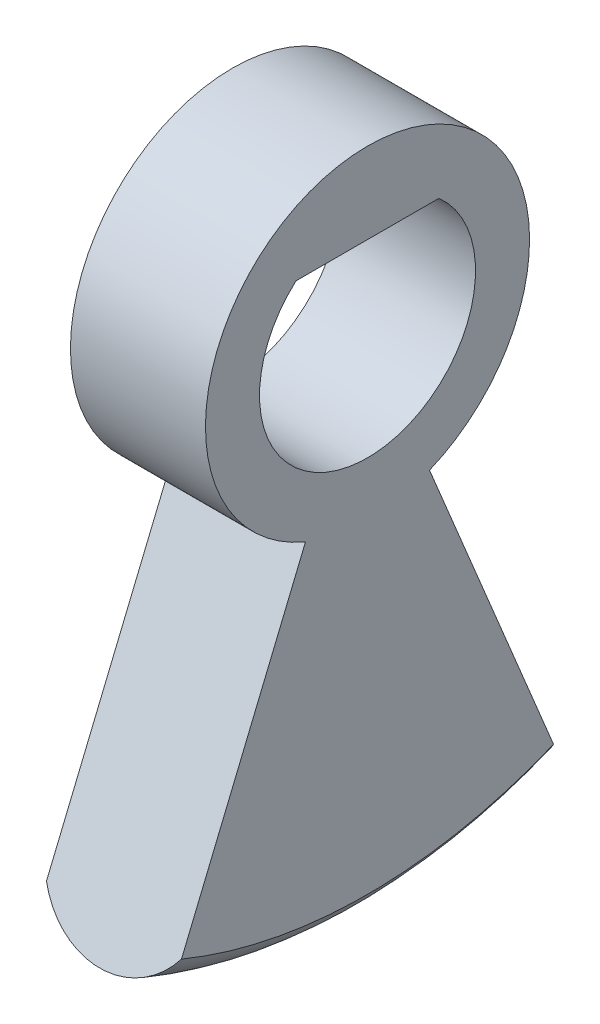
ISO-10303-21;
HEADER;
FILE_DESCRIPTION(('STEP AP214'),'2;1');
FILE_NAME('part.step','',(''),(''),'','','');
FILE_SCHEMA(('AUTOMOTIVE_DESIGN { 1 0 10303 214 1 1 1 1 }'));
ENDSEC;
DATA;
#1=APPLICATION_CONTEXT('core data for automotive mechanical design processes');
#2=APPLICATION_PROTOCOL_DEFINITION('international standard','automotive_design',2000,#1);
#3=PRODUCT_CONTEXT('',#1,'mechanical');
#4=PRODUCT('Part','Part','',(#3));
#5=PRODUCT_RELATED_PRODUCT_CATEGORY('part','',(#4));
#6=PRODUCT_DEFINITION_FORMATION('','',#4);
#7=PRODUCT_DEFINITION_CONTEXT('part definition',#1,'design');
#8=PRODUCT_DEFINITION('design','',#6,#7);
#9=PRODUCT_DEFINITION_SHAPE('','',#8);
#10=(LENGTH_UNIT() NAMED_UNIT(*) SI_UNIT(.MILLI.,.METRE.));
#11=(NAMED_UNIT(*) PLANE_ANGLE_UNIT() SI_UNIT($,.RADIAN.));
#12=(NAMED_UNIT(*) SI_UNIT($,.STERADIAN.) SOLID_ANGLE_UNIT());
#13=UNCERTAINTY_MEASURE_WITH_UNIT(LENGTH_MEASURE(1.E-05),#10,'distance_accuracy_value','');
#14=(GEOMETRIC_REPRESENTATION_CONTEXT(3) GLOBAL_UNCERTAINTY_ASSIGNED_CONTEXT((#13)) GLOBAL_UNIT_ASSIGNED_CONTEXT((#10,
#11,#12)) REPRESENTATION_CONTEXT('',''));
#15=CARTESIAN_POINT('',(0.,0.,0.));
#16=DIRECTION('',(0.,0.,1.));
#17=DIRECTION('',(1.,0.,0.));
#18=AXIS2_PLACEMENT_3D('',#15,#16,#17);
#19=CARTESIAN_POINT('',(1.25,0.,0.));
#20=DIRECTION('',(-1.,0.,0.));
#21=DIRECTION('',(0.,-1.,0.));
#22=AXIS2_PLACEMENT_3D('',#19,#20,#21);
#23=PLANE('',#22);
#24=DIRECTION('',(0.,0.,1.));
#25=VECTOR('',#24,1.);
#26=CARTESIAN_POINT('',(1.25,1.5,0.));
#27=LINE('',#26,#25);
#28=CARTESIAN_POINT('',(1.25,1.5,-1.3228756555323));
#29=VERTEX_POINT('',#28);
#30=CARTESIAN_POINT('',(1.25,1.5,1.3228756555323));
#31=VERTEX_POINT('',#30);
#32=EDGE_CURVE('E141',#29,#31,#27,.T.);
#33=ORIENTED_EDGE('',*,*,#32,.F.);
#34=CARTESIAN_POINT('',(1.25,0.,0.));
#35=DIRECTION('',(1.,0.,0.));
#36=DIRECTION('',(0.,1.,0.));
#37=AXIS2_PLACEMENT_3D('',#34,#35,#36);
#38=CIRCLE('',#37,2.);
#39=EDGE_CURVE('E91',#31,#29,#38,.T.);
#40=ORIENTED_EDGE('',*,*,#39,.F.);
#41=EDGE_LOOP('',(#33,#40));
#42=FACE_BOUND('',#41,.T.);
#43=CARTESIAN_POINT('',(1.25,0.,0.));
#44=DIRECTION('',(-1.,0.,0.));
#45=DIRECTION('',(0.,0.,1.));
#46=AXIS2_PLACEMENT_3D('',#43,#44,#45);
#47=CIRCLE('',#46,3.);
#48=CARTESIAN_POINT('',(1.25,-2.77163859753387,1.14805029709525));
#49=VERTEX_POINT('',#48);
#50=CARTESIAN_POINT('',(1.25,-2.77163859753387,-1.14805029709525));
#51=VERTEX_POINT('',#50);
#52=EDGE_CURVE('E135',#49,#51,#47,.T.);
#53=ORIENTED_EDGE('',*,*,#52,.F.);
#54=DIRECTION('',(0.,-0.923879532511289,0.382683432365084));
#55=VECTOR('',#54,1.);
#56=CARTESIAN_POINT('',(1.25000000000001,0.,0.));
#57=LINE('',#56,#55);
#58=CARTESIAN_POINT('',(1.25,-8.3149157926016,3.44415089128576));
#59=VERTEX_POINT('',#58);
#60=EDGE_CURVE('E145',#49,#59,#57,.T.);
#61=ORIENTED_EDGE('',*,*,#60,.T.);
#62=CARTESIAN_POINT('',(1.25,0.,0.));
#63=DIRECTION('',(-1.,0.,0.));
#64=DIRECTION('',(0.,-1.,0.));
#65=AXIS2_PLACEMENT_3D('',#62,#63,#64);
#66=CIRCLE('',#65,9.);
#67=CARTESIAN_POINT('',(1.25,-8.3149157926016,-3.44415089128576));
#68=VERTEX_POINT('',#67);
#69=EDGE_CURVE('E156',#68,#59,#66,.T.);
#70=ORIENTED_EDGE('',*,*,#69,.F.);
#71=DIRECTION('',(0.,-0.923879532511289,-0.382683432365084));
#72=VECTOR('',#71,1.);
#73=CARTESIAN_POINT('',(1.25000000000001,0.,0.));
#74=LINE('',#73,#72);
#75=EDGE_CURVE('E136',#51,#68,#74,.T.);
#76=ORIENTED_EDGE('',*,*,#75,.F.);
#77=EDGE_LOOP('',(#53,#61,#70,#76));
#78=FACE_BOUND('',#77,.T.);
#79=ADVANCED_FACE('F69',(#42,#78),#23,.F.);
#80=CARTESIAN_POINT('',(0.,0.,0.));
#81=DIRECTION('',(-1.,0.,0.));
#82=DIRECTION('',(0.,-1.,0.));
#83=AXIS2_PLACEMENT_3D('',#80,#81,#82);
#84=TOROIDAL_SURFACE('',#83,8.21317661740414,1.4770210003245);
#85=ORIENTED_EDGE('',*,*,#69,.T.);
#86=CARTESIAN_POINT('',(0.,-7.58798577371999,3.14304661856887));
#87=DIRECTION('',(0.,-0.382683432365084,-0.923879532511289));
#88=DIRECTION('',(1.,0.,0.));
#89=AXIS2_PLACEMENT_3D('',#86,#87,#88);
#90=CIRCLE('',#89,1.4770210003245);
#91=CARTESIAN_POINT('',(-1.25,-8.3149157926016,3.44415089128576));
#92=VERTEX_POINT('',#91);
#93=EDGE_CURVE('E172',#92,#59,#90,.F.);
#94=ORIENTED_EDGE('',*,*,#93,.F.);
#95=CARTESIAN_POINT('',(-1.25,0.,0.));
#96=DIRECTION('',(-1.,0.,0.));
#97=DIRECTION('',(0.,-1.,0.));
#98=AXIS2_PLACEMENT_3D('',#95,#96,#97);
#99=CIRCLE('',#98,9.);
#100=CARTESIAN_POINT('',(-1.25,-8.3149157926016,-3.44415089128576));
#101=VERTEX_POINT('',#100);
#102=EDGE_CURVE('E153',#101,#92,#99,.T.);
#103=ORIENTED_EDGE('',*,*,#102,.F.);
#104=CARTESIAN_POINT('',(0.,-7.58798577371999,-3.14304661856887));
#105=DIRECTION('',(0.,0.382683432365084,-0.923879532511289));
#106=DIRECTION('',(1.,0.,0.));
#107=AXIS2_PLACEMENT_3D('',#104,#105,#106);
#108=CIRCLE('',#107,1.4770210003245);
#109=EDGE_CURVE('E83',#101,#68,#108,.F.);
#110=ORIENTED_EDGE('',*,*,#109,.T.);
#111=EDGE_LOOP('',(#85,#94,#103,#110));
#112=FACE_BOUND('',#111,.T.);
#113=ADVANCED_FACE('F168',(#112),#84,.T.);
#114=CARTESIAN_POINT('',(-1.25,9.,0.));
#115=DIRECTION('',(1.,0.,0.));
#116=DIRECTION('',(0.,1.,0.));
#117=AXIS2_PLACEMENT_3D('',#114,#115,#116);
#118=PLANE('',#117);
#119=DIRECTION('',(0.,0.,1.));
#120=VECTOR('',#119,1.);
#121=CARTESIAN_POINT('',(-1.25,1.5,0.));
#122=LINE('',#121,#120);
#123=CARTESIAN_POINT('',(-1.25,1.5,-1.3228756555323));
#124=VERTEX_POINT('',#123);
#125=CARTESIAN_POINT('',(-1.25,1.5,1.3228756555323));
#126=VERTEX_POINT('',#125);
#127=EDGE_CURVE('E76',#124,#126,#122,.T.);
#128=ORIENTED_EDGE('',*,*,#127,.T.);
#129=CARTESIAN_POINT('',(-1.25,0.,0.));
#130=DIRECTION('',(1.,0.,0.));
#131=DIRECTION('',(0.,1.,0.));
#132=AXIS2_PLACEMENT_3D('',#129,#130,#131);
#133=CIRCLE('',#132,2.);
#134=EDGE_CURVE('E12',#126,#124,#133,.T.);
#135=ORIENTED_EDGE('',*,*,#134,.T.);
#136=EDGE_LOOP('',(#128,#135));
#137=FACE_BOUND('',#136,.T.);
#138=ORIENTED_EDGE('',*,*,#102,.T.);
#139=DIRECTION('',(0.,0.923879532511289,-0.382683432365084));
#140=VECTOR('',#139,1.);
#141=CARTESIAN_POINT('',(-1.25,0.,0.));
#142=LINE('',#141,#140);
#143=CARTESIAN_POINT('',(-1.25,-2.77163859753387,1.14805029709525));
#144=VERTEX_POINT('',#143);
#145=EDGE_CURVE('E140',#92,#144,#142,.T.);
#146=ORIENTED_EDGE('',*,*,#145,.T.);
#147=CARTESIAN_POINT('',(-1.25,0.,0.));
#148=DIRECTION('',(-1.,0.,0.));
#149=DIRECTION('',(0.,0.,1.));
#150=AXIS2_PLACEMENT_3D('',#147,#148,#149);
#151=CIRCLE('',#150,3.);
#152=CARTESIAN_POINT('',(-1.25,-2.77163859753387,-1.14805029709525));
#153=VERTEX_POINT('',#152);
#154=EDGE_CURVE('E132',#144,#153,#151,.T.);
#155=ORIENTED_EDGE('',*,*,#154,.T.);
#156=DIRECTION('',(0.,0.923879532511289,0.382683432365084));
#157=VECTOR('',#156,1.);
#158=CARTESIAN_POINT('',(-1.25,0.,0.));
#159=LINE('',#158,#157);
#160=EDGE_CURVE('E120',#101,#153,#159,.T.);
#161=ORIENTED_EDGE('',*,*,#160,.F.);
#162=EDGE_LOOP('',(#138,#146,#155,#161));
#163=FACE_BOUND('',#162,.T.);
#164=ADVANCED_FACE('F139',(#137,#163),#118,.F.);
#165=CARTESIAN_POINT('',(-8.75,0.,0.));
#166=DIRECTION('',(1.,0.,0.));
#167=DIRECTION('',(0.,1.,0.));
#168=AXIS2_PLACEMENT_3D('',#165,#166,#167);
#169=CYLINDRICAL_SURFACE('',#168,2.);
#170=DIRECTION('',(1.,0.,0.));
#171=VECTOR('',#170,1.);
#172=CARTESIAN_POINT('',(-8.75,1.5,1.3228756555323));
#173=LINE('',#172,#171);
#174=EDGE_CURVE('E150',#126,#31,#173,.T.);
#175=ORIENTED_EDGE('',*,*,#174,.T.);
#176=ORIENTED_EDGE('',*,*,#39,.T.);
#177=DIRECTION('',(1.,0.,0.));
#178=VECTOR('',#177,1.);
#179=CARTESIAN_POINT('',(-8.75,1.5,-1.3228756555323));
#180=LINE('',#179,#178);
#181=EDGE_CURVE('E151',#124,#29,#180,.T.);
#182=ORIENTED_EDGE('',*,*,#181,.F.);
#183=ORIENTED_EDGE('',*,*,#134,.F.);
#184=EDGE_LOOP('',(#175,#176,#182,#183));
#185=FACE_BOUND('',#184,.T.);
#186=ADVANCED_FACE('F164',(#185),#169,.F.);
#187=CARTESIAN_POINT('',(-8.75,1.5,0.));
#188=DIRECTION('',(0.,1.,0.));
#189=DIRECTION('',(-1.,0.,0.));
#190=AXIS2_PLACEMENT_3D('',#187,#188,#189);
#191=PLANE('',#190);
#192=ORIENTED_EDGE('',*,*,#181,.T.);
#193=ORIENTED_EDGE('',*,*,#32,.T.);
#194=ORIENTED_EDGE('',*,*,#174,.F.);
#195=ORIENTED_EDGE('',*,*,#127,.F.);
#196=EDGE_LOOP('',(#192,#193,#194,#195));
#197=FACE_BOUND('',#196,.T.);
#198=ADVANCED_FACE('F162',(#197),#191,.F.);
#199=CARTESIAN_POINT('',(-1.25,0.,0.));
#200=DIRECTION('',(-1.,0.,0.));
#201=DIRECTION('',(0.,0.,1.));
#202=AXIS2_PLACEMENT_3D('',#199,#200,#201);
#203=CYLINDRICAL_SURFACE('',#202,3.);
#204=ORIENTED_EDGE('',*,*,#52,.T.);
#205=DIRECTION('',(1.,0.,0.));
#206=VECTOR('',#205,1.);
#207=CARTESIAN_POINT('',(0.,-2.77163859753387,-1.14805029709525));
#208=LINE('',#207,#206);
#209=EDGE_CURVE('E123',#153,#51,#208,.T.);
#210=ORIENTED_EDGE('',*,*,#209,.F.);
#211=ORIENTED_EDGE('',*,*,#154,.F.);
#212=DIRECTION('',(1.,0.,0.));
#213=VECTOR('',#212,1.);
#214=CARTESIAN_POINT('',(0.,-2.77163859753387,1.14805029709525));
#215=LINE('',#214,#213);
#216=EDGE_CURVE('E177',#144,#49,#215,.T.);
#217=ORIENTED_EDGE('',*,*,#216,.T.);
#218=EDGE_LOOP('',(#204,#210,#211,#217));
#219=FACE_BOUND('',#218,.T.);
#220=ADVANCED_FACE('F131',(#219),#203,.T.);
#221=CARTESIAN_POINT('',(0.,0.,0.));
#222=DIRECTION('',(0.,-0.382683432365084,-0.923879532511289));
#223=DIRECTION('',(1.,0.,0.));
#224=AXIS2_PLACEMENT_3D('',#221,#222,#223);
#225=PLANE('',#224);
#226=ORIENTED_EDGE('',*,*,#93,.T.);
#227=ORIENTED_EDGE('',*,*,#60,.F.);
#228=ORIENTED_EDGE('',*,*,#216,.F.);
#229=ORIENTED_EDGE('',*,*,#145,.F.);
#230=EDGE_LOOP('',(#226,#227,#228,#229));
#231=FACE_BOUND('',#230,.T.);
#232=ADVANCED_FACE('F179',(#231),#225,.F.);
#233=CARTESIAN_POINT('',(0.,0.,0.));
#234=DIRECTION('',(0.,0.382683432365084,-0.923879532511289));
#235=DIRECTION('',(1.,0.,0.));
#236=AXIS2_PLACEMENT_3D('',#233,#234,#235);
#237=PLANE('',#236);
#238=ORIENTED_EDGE('',*,*,#109,.F.);
#239=ORIENTED_EDGE('',*,*,#160,.T.);
#240=ORIENTED_EDGE('',*,*,#209,.T.);
#241=ORIENTED_EDGE('',*,*,#75,.T.);
#242=EDGE_LOOP('',(#238,#239,#240,#241));
#243=FACE_BOUND('',#242,.T.);
#244=ADVANCED_FACE('F122',(#243),#237,.T.);
#245=CLOSED_SHELL('',(#79,#113,#164,#186,#198,#220,#232,#244));
#246=MANIFOLD_SOLID_BREP('B2',#245);
#247=ADVANCED_BREP_SHAPE_REPRESENTATION('',(#18,#246),#14);
#248=SHAPE_DEFINITION_REPRESENTATION(#9,#247);
ENDSEC;
END-ISO-10303-21;
